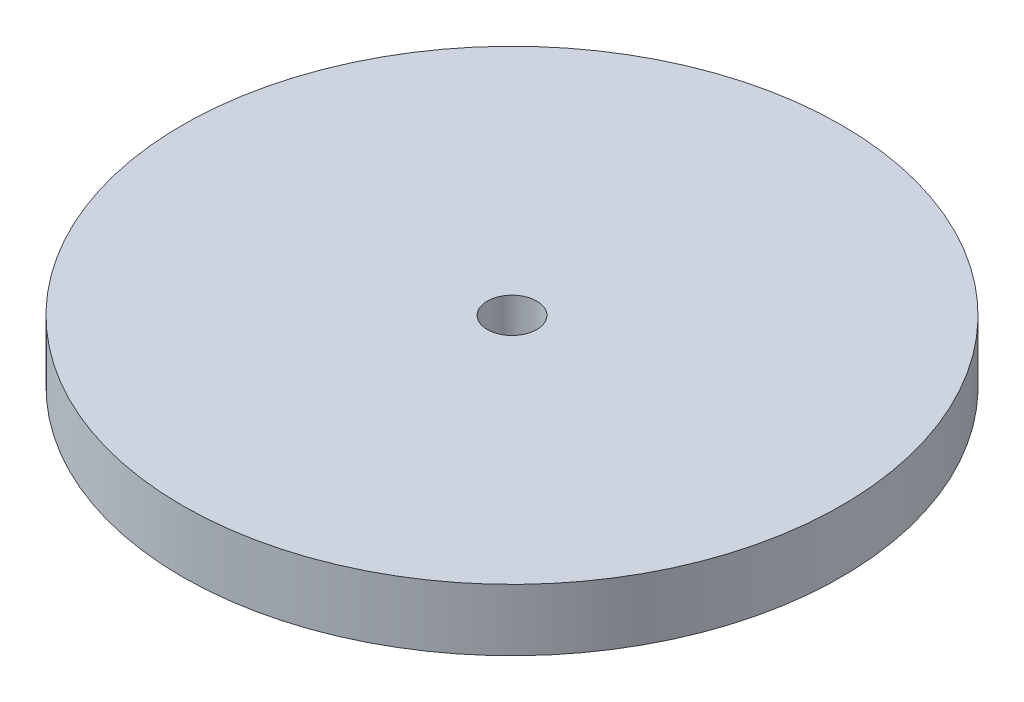
ISO-10303-21;
HEADER;
FILE_DESCRIPTION(('STEP AP214'),'2;1');
FILE_NAME('part.step','',(''),(''),'','','');
FILE_SCHEMA(('AUTOMOTIVE_DESIGN { 1 0 10303 214 1 1 1 1 }'));
ENDSEC;
DATA;
#1=APPLICATION_CONTEXT('core data for automotive mechanical design processes');
#2=APPLICATION_PROTOCOL_DEFINITION('international standard','automotive_design',2000,#1);
#3=PRODUCT_CONTEXT('',#1,'mechanical');
#4=PRODUCT('Part','Part','',(#3));
#5=PRODUCT_RELATED_PRODUCT_CATEGORY('part','',(#4));
#6=PRODUCT_DEFINITION_FORMATION('','',#4);
#7=PRODUCT_DEFINITION_CONTEXT('part definition',#1,'design');
#8=PRODUCT_DEFINITION('design','',#6,#7);
#9=PRODUCT_DEFINITION_SHAPE('','',#8);
#10=(LENGTH_UNIT() NAMED_UNIT(*) SI_UNIT(.MILLI.,.METRE.));
#11=(NAMED_UNIT(*) PLANE_ANGLE_UNIT() SI_UNIT($,.RADIAN.));
#12=(NAMED_UNIT(*) SI_UNIT($,.STERADIAN.) SOLID_ANGLE_UNIT());
#13=UNCERTAINTY_MEASURE_WITH_UNIT(LENGTH_MEASURE(1.E-05),#10,'distance_accuracy_value','');
#14=(GEOMETRIC_REPRESENTATION_CONTEXT(3) GLOBAL_UNCERTAINTY_ASSIGNED_CONTEXT((#13)) GLOBAL_UNIT_ASSIGNED_CONTEXT((#10,
#11,#12)) REPRESENTATION_CONTEXT('',''));
#15=CARTESIAN_POINT('',(0.,0.,0.));
#16=DIRECTION('',(0.,0.,1.));
#17=DIRECTION('',(1.,0.,0.));
#18=AXIS2_PLACEMENT_3D('',#15,#16,#17);
#19=CARTESIAN_POINT('',(0.,15.,0.));
#20=DIRECTION('',(0.,-1.,0.));
#21=DIRECTION('',(0.,0.,-1.));
#22=AXIS2_PLACEMENT_3D('',#19,#20,#21);
#23=CYLINDRICAL_SURFACE('',#22,80.);
#24=CARTESIAN_POINT('',(0.,15.,0.));
#25=DIRECTION('',(0.,1.,0.));
#26=DIRECTION('',(0.,0.,1.));
#27=AXIS2_PLACEMENT_3D('',#24,#25,#26);
#28=CIRCLE('',#27,80.);
#29=CARTESIAN_POINT('',(0.,15.,80.));
#30=VERTEX_POINT('',#29);
#31=EDGE_CURVE('E10',#30,#30,#28,.T.);
#32=ORIENTED_EDGE('',*,*,#31,.F.);
#33=EDGE_LOOP('',(#32));
#34=FACE_BOUND('',#33,.T.);
#35=CARTESIAN_POINT('',(0.,0.,0.));
#36=DIRECTION('',(0.,1.,0.));
#37=DIRECTION('',(0.,0.,1.));
#38=AXIS2_PLACEMENT_3D('',#35,#36,#37);
#39=CIRCLE('',#38,80.);
#40=CARTESIAN_POINT('',(0.,0.,80.));
#41=VERTEX_POINT('',#40);
#42=EDGE_CURVE('E44',#41,#41,#39,.T.);
#43=ORIENTED_EDGE('',*,*,#42,.T.);
#44=EDGE_LOOP('',(#43));
#45=FACE_BOUND('',#44,.T.);
#46=ADVANCED_FACE('F41',(#34,#45),#23,.T.);
#47=CARTESIAN_POINT('',(0.,15.,0.));
#48=DIRECTION('',(0.,1.,0.));
#49=DIRECTION('',(0.,0.,1.));
#50=AXIS2_PLACEMENT_3D('',#47,#48,#49);
#51=PLANE('',#50);
#52=CARTESIAN_POINT('',(0.,15.,0.));
#53=DIRECTION('',(0.,1.,0.));
#54=DIRECTION('',(0.,0.,1.));
#55=AXIS2_PLACEMENT_3D('',#52,#53,#54);
#56=CIRCLE('',#55,6.);
#57=CARTESIAN_POINT('',(0.,15.,6.));
#58=VERTEX_POINT('',#57);
#59=EDGE_CURVE('E51',#58,#58,#56,.T.);
#60=ORIENTED_EDGE('',*,*,#59,.F.);
#61=EDGE_LOOP('',(#60));
#62=FACE_BOUND('',#61,.T.);
#63=ORIENTED_EDGE('',*,*,#31,.T.);
#64=EDGE_LOOP('',(#63));
#65=FACE_BOUND('',#64,.T.);
#66=ADVANCED_FACE('F62',(#62,#65),#51,.T.);
#67=CARTESIAN_POINT('',(0.,0.,0.));
#68=DIRECTION('',(0.,1.,0.));
#69=DIRECTION('',(0.,0.,1.));
#70=AXIS2_PLACEMENT_3D('',#67,#68,#69);
#71=PLANE('',#70);
#72=CARTESIAN_POINT('',(0.,0.,0.));
#73=DIRECTION('',(0.,1.,0.));
#74=DIRECTION('',(0.,0.,1.));
#75=AXIS2_PLACEMENT_3D('',#72,#73,#74);
#76=CIRCLE('',#75,6.);
#77=CARTESIAN_POINT('',(0.,0.,6.));
#78=VERTEX_POINT('',#77);
#79=EDGE_CURVE('E53',#78,#78,#76,.T.);
#80=ORIENTED_EDGE('',*,*,#79,.T.);
#81=EDGE_LOOP('',(#80));
#82=FACE_BOUND('',#81,.T.);
#83=ORIENTED_EDGE('',*,*,#42,.F.);
#84=EDGE_LOOP('',(#83));
#85=FACE_BOUND('',#84,.T.);
#86=ADVANCED_FACE('F64',(#82,#85),#71,.F.);
#87=CARTESIAN_POINT('',(0.,15.,0.));
#88=DIRECTION('',(0.,-1.,0.));
#89=DIRECTION('',(0.,0.,-1.));
#90=AXIS2_PLACEMENT_3D('',#87,#88,#89);
#91=CYLINDRICAL_SURFACE('',#90,6.);
#92=ORIENTED_EDGE('',*,*,#59,.T.);
#93=EDGE_LOOP('',(#92));
#94=FACE_BOUND('',#93,.T.);
#95=ORIENTED_EDGE('',*,*,#79,.F.);
#96=EDGE_LOOP('',(#95));
#97=FACE_BOUND('',#96,.T.);
#98=ADVANCED_FACE('F59',(#94,#97),#91,.F.);
#99=CLOSED_SHELL('',(#46,#66,#86,#98));
#100=MANIFOLD_SOLID_BREP('B2',#99);
#101=ADVANCED_BREP_SHAPE_REPRESENTATION('',(#18,#100),#14);
#102=SHAPE_DEFINITION_REPRESENTATION(#9,#101);
ENDSEC;
END-ISO-10303-21;
